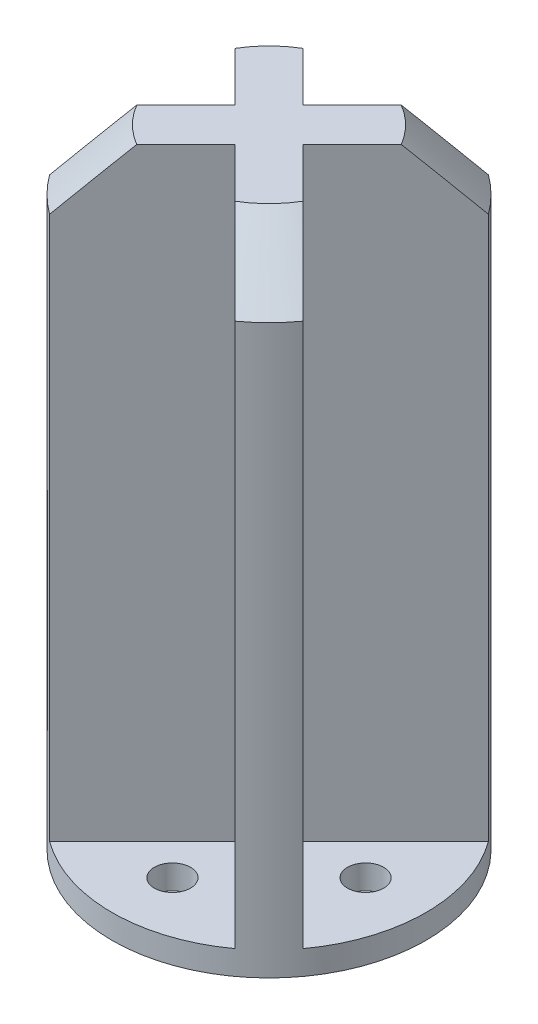
ISO-10303-21;
HEADER;
FILE_DESCRIPTION(('STEP AP214'),'2;1');
FILE_NAME('part.step','',(''),(''),'','','');
FILE_SCHEMA(('AUTOMOTIVE_DESIGN { 1 0 10303 214 1 1 1 1 }'));
ENDSEC;
DATA;
#1=APPLICATION_CONTEXT('core data for automotive mechanical design processes');
#2=APPLICATION_PROTOCOL_DEFINITION('international standard','automotive_design',2000,#1);
#3=PRODUCT_CONTEXT('',#1,'mechanical');
#4=PRODUCT('Part','Part','',(#3));
#5=PRODUCT_RELATED_PRODUCT_CATEGORY('part','',(#4));
#6=PRODUCT_DEFINITION_FORMATION('','',#4);
#7=PRODUCT_DEFINITION_CONTEXT('part definition',#1,'design');
#8=PRODUCT_DEFINITION('design','',#6,#7);
#9=PRODUCT_DEFINITION_SHAPE('','',#8);
#10=(LENGTH_UNIT() NAMED_UNIT(*) SI_UNIT(.MILLI.,.METRE.));
#11=(NAMED_UNIT(*) PLANE_ANGLE_UNIT() SI_UNIT($,.RADIAN.));
#12=(NAMED_UNIT(*) SI_UNIT($,.STERADIAN.) SOLID_ANGLE_UNIT());
#13=UNCERTAINTY_MEASURE_WITH_UNIT(LENGTH_MEASURE(1.E-05),#10,'distance_accuracy_value','');
#14=(GEOMETRIC_REPRESENTATION_CONTEXT(3) GLOBAL_UNCERTAINTY_ASSIGNED_CONTEXT((#13)) GLOBAL_UNIT_ASSIGNED_CONTEXT((#10,
#11,#12)) REPRESENTATION_CONTEXT('',''));
#15=CARTESIAN_POINT('',(0.,0.,0.));
#16=DIRECTION('',(0.,0.,1.));
#17=DIRECTION('',(1.,0.,0.));
#18=AXIS2_PLACEMENT_3D('',#15,#16,#17);
#19=CARTESIAN_POINT('',(0.,2.,0.));
#20=DIRECTION('',(0.,1.,0.));
#21=DIRECTION('',(0.,0.,1.));
#22=AXIS2_PLACEMENT_3D('',#19,#20,#21);
#23=PLANE('',#22);
#24=CARTESIAN_POINT('',(-8.,2.,0.));
#25=DIRECTION('',(0.,1.,0.));
#26=DIRECTION('',(0.,0.,1.));
#27=AXIS2_PLACEMENT_3D('',#24,#25,#26);
#28=CIRCLE('',#27,1.5);
#29=CARTESIAN_POINT('',(-8.,2.,1.5));
#30=VERTEX_POINT('',#29);
#31=EDGE_CURVE('E195',#30,#30,#28,.T.);
#32=ORIENTED_EDGE('',*,*,#31,.F.);
#33=EDGE_LOOP('',(#32));
#34=FACE_BOUND('',#33,.T.);
#35=CARTESIAN_POINT('',(0.,2.,0.));
#36=DIRECTION('',(0.,1.,0.));
#37=DIRECTION('',(0.,0.,1.));
#38=AXIS2_PLACEMENT_3D('',#35,#36,#37);
#39=CIRCLE('',#38,13.);
#40=CARTESIAN_POINT('',(-10.4971646246656,2.,-7.66873749991938));
#41=VERTEX_POINT('',#40);
#42=CARTESIAN_POINT('',(-10.4971646246656,2.,7.66873749991938));
#43=VERTEX_POINT('',#42);
#44=EDGE_CURVE('E218',#41,#43,#39,.T.);
#45=ORIENTED_EDGE('',*,*,#44,.T.);
#46=DIRECTION('',(0.707106781186548,0.,-0.707106781186548));
#47=VECTOR('',#46,1.);
#48=CARTESIAN_POINT('',(-1.4142135623731,2.,-1.4142135623731));
#49=LINE('',#48,#47);
#50=CARTESIAN_POINT('',(-2.82842712474619,2.,0.));
#51=VERTEX_POINT('',#50);
#52=EDGE_CURVE('E346',#43,#51,#49,.T.);
#53=ORIENTED_EDGE('',*,*,#52,.T.);
#54=DIRECTION('',(0.707106781186548,0.,0.707106781186547));
#55=VECTOR('',#54,1.);
#56=CARTESIAN_POINT('',(-1.41421356237309,2.,1.4142135623731));
#57=LINE('',#56,#55);
#58=EDGE_CURVE('E356',#41,#51,#57,.T.);
#59=ORIENTED_EDGE('',*,*,#58,.F.);
#60=EDGE_LOOP('',(#45,#53,#59));
#61=FACE_BOUND('',#60,.T.);
#62=ADVANCED_FACE('F35',(#34,#61),#23,.T.);
#63=CARTESIAN_POINT('',(0.,2.,-8.));
#64=DIRECTION('',(0.,1.,0.));
#65=DIRECTION('',(0.,0.,1.));
#66=AXIS2_PLACEMENT_3D('',#63,#64,#65);
#67=CIRCLE('',#66,1.5);
#68=CARTESIAN_POINT('',(0.,2.,-6.5));
#69=VERTEX_POINT('',#68);
#70=EDGE_CURVE('E201',#69,#69,#67,.T.);
#71=ORIENTED_EDGE('',*,*,#70,.F.);
#72=EDGE_LOOP('',(#71));
#73=FACE_BOUND('',#72,.T.);
#74=CARTESIAN_POINT('',(7.66873749991938,2.,-10.4971646246656));
#75=VERTEX_POINT('',#74);
#76=CARTESIAN_POINT('',(-7.66873749991939,2.,-10.4971646246656));
#77=VERTEX_POINT('',#76);
#78=EDGE_CURVE('E386',#75,#77,#39,.T.);
#79=ORIENTED_EDGE('',*,*,#78,.T.);
#80=DIRECTION('',(0.707106781186548,0.,0.707106781186547));
#81=VECTOR('',#80,1.);
#82=CARTESIAN_POINT('',(1.4142135623731,2.,-1.4142135623731));
#83=LINE('',#82,#81);
#84=CARTESIAN_POINT('',(0.,2.,-2.82842712474619));
#85=VERTEX_POINT('',#84);
#86=EDGE_CURVE('E354',#77,#85,#83,.T.);
#87=ORIENTED_EDGE('',*,*,#86,.T.);
#88=DIRECTION('',(-0.707106781186548,0.,0.707106781186548));
#89=VECTOR('',#88,1.);
#90=CARTESIAN_POINT('',(-1.41421356237309,2.,-1.41421356237309));
#91=LINE('',#90,#89);
#92=EDGE_CURVE('E351',#75,#85,#91,.T.);
#93=ORIENTED_EDGE('',*,*,#92,.F.);
#94=EDGE_LOOP('',(#79,#87,#93));
#95=FACE_BOUND('',#94,.T.);
#96=ADVANCED_FACE('F314',(#73,#95),#23,.T.);
#97=CARTESIAN_POINT('',(8.,2.,0.));
#98=DIRECTION('',(0.,1.,0.));
#99=DIRECTION('',(0.,0.,1.));
#100=AXIS2_PLACEMENT_3D('',#97,#98,#99);
#101=CIRCLE('',#100,1.5);
#102=CARTESIAN_POINT('',(8.,2.,1.50000000000006));
#103=VERTEX_POINT('',#102);
#104=EDGE_CURVE('E207',#103,#103,#101,.T.);
#105=ORIENTED_EDGE('',*,*,#104,.F.);
#106=EDGE_LOOP('',(#105));
#107=FACE_BOUND('',#106,.T.);
#108=CARTESIAN_POINT('',(10.4971646246656,2.,7.66873749991938));
#109=VERTEX_POINT('',#108);
#110=CARTESIAN_POINT('',(10.4971646246656,2.,-7.66873749991938));
#111=VERTEX_POINT('',#110);
#112=EDGE_CURVE('E219',#109,#111,#39,.T.);
#113=ORIENTED_EDGE('',*,*,#112,.T.);
#114=DIRECTION('',(-0.707106781186548,0.,0.707106781186548));
#115=VECTOR('',#114,1.);
#116=CARTESIAN_POINT('',(1.41421356237309,2.,1.41421356237309));
#117=LINE('',#116,#115);
#118=CARTESIAN_POINT('',(2.82842712474619,2.,0.));
#119=VERTEX_POINT('',#118);
#120=EDGE_CURVE('E344',#111,#119,#117,.T.);
#121=ORIENTED_EDGE('',*,*,#120,.T.);
#122=DIRECTION('',(-0.707106781186548,0.,-0.707106781186547));
#123=VECTOR('',#122,1.);
#124=CARTESIAN_POINT('',(1.41421356237309,2.,-1.41421356237309));
#125=LINE('',#124,#123);
#126=EDGE_CURVE('E341',#109,#119,#125,.T.);
#127=ORIENTED_EDGE('',*,*,#126,.F.);
#128=EDGE_LOOP('',(#113,#121,#127));
#129=FACE_BOUND('',#128,.T.);
#130=ADVANCED_FACE('F321',(#107,#129),#23,.T.);
#131=CARTESIAN_POINT('',(0.,2.,8.));
#132=DIRECTION('',(0.,1.,0.));
#133=DIRECTION('',(0.,0.,1.));
#134=AXIS2_PLACEMENT_3D('',#131,#132,#133);
#135=CIRCLE('',#134,1.5);
#136=CARTESIAN_POINT('',(0.,2.,9.5));
#137=VERTEX_POINT('',#136);
#138=EDGE_CURVE('E190',#137,#137,#135,.T.);
#139=ORIENTED_EDGE('',*,*,#138,.F.);
#140=EDGE_LOOP('',(#139));
#141=FACE_BOUND('',#140,.T.);
#142=CARTESIAN_POINT('',(-7.66873749991938,2.,10.4971646246656));
#143=VERTEX_POINT('',#142);
#144=CARTESIAN_POINT('',(7.66873749991938,2.,10.4971646246656));
#145=VERTEX_POINT('',#144);
#146=EDGE_CURVE('E215',#143,#145,#39,.T.);
#147=ORIENTED_EDGE('',*,*,#146,.T.);
#148=DIRECTION('',(-0.707106781186547,0.,-0.707106781186548));
#149=VECTOR('',#148,1.);
#150=CARTESIAN_POINT('',(-1.41421356237309,2.,1.41421356237309));
#151=LINE('',#150,#149);
#152=CARTESIAN_POINT('',(0.,2.,2.82842712474619));
#153=VERTEX_POINT('',#152);
#154=EDGE_CURVE('E339',#145,#153,#151,.T.);
#155=ORIENTED_EDGE('',*,*,#154,.T.);
#156=DIRECTION('',(0.707106781186548,0.,-0.707106781186548));
#157=VECTOR('',#156,1.);
#158=CARTESIAN_POINT('',(1.41421356237309,2.,1.41421356237309));
#159=LINE('',#158,#157);
#160=EDGE_CURVE('E179',#143,#153,#159,.T.);
#161=ORIENTED_EDGE('',*,*,#160,.F.);
#162=EDGE_LOOP('',(#147,#155,#161));
#163=FACE_BOUND('',#162,.T.);
#164=ADVANCED_FACE('F317',(#141,#163),#23,.T.);
#165=CARTESIAN_POINT('',(0.,2.,0.));
#166=DIRECTION('',(0.,-1.,0.));
#167=DIRECTION('',(0.,0.,-1.));
#168=AXIS2_PLACEMENT_3D('',#165,#166,#167);
#169=CYLINDRICAL_SURFACE('',#168,13.);
#170=DIRECTION('',(0.,-1.,0.));
#171=VECTOR('',#170,1.);
#172=CARTESIAN_POINT('',(-7.66873749991938,52.,10.4971646246656));
#173=LINE('',#172,#171);
#174=CARTESIAN_POINT('',(-7.66873749991938,47.,10.4971646246656));
#175=VERTEX_POINT('',#174);
#176=EDGE_CURVE('E180',#175,#143,#173,.T.);
#177=ORIENTED_EDGE('',*,*,#176,.F.);
#178=CARTESIAN_POINT('',(0.,47.,0.));
#179=DIRECTION('',(0.,1.,0.));
#180=DIRECTION('',(0.,0.,1.));
#181=AXIS2_PLACEMENT_3D('',#178,#179,#180);
#182=CIRCLE('',#181,13.);
#183=CARTESIAN_POINT('',(-10.4971646246656,47.,7.66873749991938));
#184=VERTEX_POINT('',#183);
#185=EDGE_CURVE('E265',#175,#184,#182,.F.);
#186=ORIENTED_EDGE('',*,*,#185,.T.);
#187=DIRECTION('',(0.,-1.,0.));
#188=VECTOR('',#187,1.);
#189=CARTESIAN_POINT('',(-10.4971646246656,52.,7.66873749991938));
#190=LINE('',#189,#188);
#191=EDGE_CURVE('E183',#184,#43,#190,.T.);
#192=ORIENTED_EDGE('',*,*,#191,.T.);
#193=ORIENTED_EDGE('',*,*,#44,.F.);
#194=DIRECTION('',(0.,-1.,0.));
#195=VECTOR('',#194,1.);
#196=CARTESIAN_POINT('',(-10.4971646246656,52.,-7.66873749991938));
#197=LINE('',#196,#195);
#198=CARTESIAN_POINT('',(-10.4971646246656,47.,-7.66873749991938));
#199=VERTEX_POINT('',#198);
#200=EDGE_CURVE('E362',#199,#41,#197,.T.);
#201=ORIENTED_EDGE('',*,*,#200,.F.);
#202=CARTESIAN_POINT('',(0.,47.,0.));
#203=DIRECTION('',(0.,1.,0.));
#204=DIRECTION('',(0.,0.,1.));
#205=AXIS2_PLACEMENT_3D('',#202,#203,#204);
#206=CIRCLE('',#205,13.);
#207=CARTESIAN_POINT('',(-7.66873749991939,47.,-10.4971646246656));
#208=VERTEX_POINT('',#207);
#209=EDGE_CURVE('E238',#199,#208,#206,.F.);
#210=ORIENTED_EDGE('',*,*,#209,.T.);
#211=DIRECTION('',(0.,-1.,0.));
#212=VECTOR('',#211,1.);
#213=CARTESIAN_POINT('',(-7.66873749991939,52.,-10.4971646246656));
#214=LINE('',#213,#212);
#215=EDGE_CURVE('E365',#208,#77,#214,.T.);
#216=ORIENTED_EDGE('',*,*,#215,.T.);
#217=ORIENTED_EDGE('',*,*,#78,.F.);
#218=DIRECTION('',(0.,-1.,0.));
#219=VECTOR('',#218,1.);
#220=CARTESIAN_POINT('',(7.66873749991938,52.,-10.4971646246656));
#221=LINE('',#220,#219);
#222=CARTESIAN_POINT('',(7.66873749991938,47.,-10.4971646246656));
#223=VERTEX_POINT('',#222);
#224=EDGE_CURVE('E370',#223,#75,#221,.T.);
#225=ORIENTED_EDGE('',*,*,#224,.F.);
#226=CARTESIAN_POINT('',(0.,47.,0.));
#227=DIRECTION('',(0.,1.,0.));
#228=DIRECTION('',(0.,0.,1.));
#229=AXIS2_PLACEMENT_3D('',#226,#227,#228);
#230=CIRCLE('',#229,13.);
#231=CARTESIAN_POINT('',(10.4971646246656,47.,-7.66873749991938));
#232=VERTEX_POINT('',#231);
#233=EDGE_CURVE('E55',#223,#232,#230,.F.);
#234=ORIENTED_EDGE('',*,*,#233,.T.);
#235=DIRECTION('',(0.,-1.,0.));
#236=VECTOR('',#235,1.);
#237=CARTESIAN_POINT('',(10.4971646246656,52.,-7.66873749991938));
#238=LINE('',#237,#236);
#239=EDGE_CURVE('E372',#232,#111,#238,.T.);
#240=ORIENTED_EDGE('',*,*,#239,.T.);
#241=ORIENTED_EDGE('',*,*,#112,.F.);
#242=DIRECTION('',(0.,-1.,0.));
#243=VECTOR('',#242,1.);
#244=CARTESIAN_POINT('',(10.4971646246656,52.,7.66873749991938));
#245=LINE('',#244,#243);
#246=CARTESIAN_POINT('',(10.4971646246656,47.,7.66873749991938));
#247=VERTEX_POINT('',#246);
#248=EDGE_CURVE('E185',#247,#109,#245,.T.);
#249=ORIENTED_EDGE('',*,*,#248,.F.);
#250=CARTESIAN_POINT('',(0.,47.,0.));
#251=DIRECTION('',(0.,1.,0.));
#252=DIRECTION('',(0.,0.,1.));
#253=AXIS2_PLACEMENT_3D('',#250,#251,#252);
#254=CIRCLE('',#253,13.);
#255=CARTESIAN_POINT('',(7.66873749991938,47.,10.4971646246656));
#256=VERTEX_POINT('',#255);
#257=EDGE_CURVE('E419',#247,#256,#254,.F.);
#258=ORIENTED_EDGE('',*,*,#257,.T.);
#259=DIRECTION('',(0.,-1.,0.));
#260=VECTOR('',#259,1.);
#261=CARTESIAN_POINT('',(7.66873749991938,52.,10.4971646246656));
#262=LINE('',#261,#260);
#263=EDGE_CURVE('E181',#256,#145,#262,.T.);
#264=ORIENTED_EDGE('',*,*,#263,.T.);
#265=ORIENTED_EDGE('',*,*,#146,.F.);
#266=EDGE_LOOP('',(#177,#186,#192,#193,#201,#210,#216,#217,#225,#234,#240,#241,#249,#258,#264,#265));
#267=FACE_BOUND('',#266,.T.);
#268=CARTESIAN_POINT('',(0.,0.,0.));
#269=DIRECTION('',(0.,1.,0.));
#270=DIRECTION('',(0.,0.,1.));
#271=AXIS2_PLACEMENT_3D('',#268,#269,#270);
#272=CIRCLE('',#271,13.);
#273=CARTESIAN_POINT('',(0.,0.,13.));
#274=VERTEX_POINT('',#273);
#275=EDGE_CURVE('E194',#274,#274,#272,.T.);
#276=ORIENTED_EDGE('',*,*,#275,.T.);
#277=EDGE_LOOP('',(#276));
#278=FACE_BOUND('',#277,.T.);
#279=ADVANCED_FACE('F328',(#267,#278),#169,.T.);
#280=CARTESIAN_POINT('',(0.,0.,0.));
#281=DIRECTION('',(0.,1.,0.));
#282=DIRECTION('',(0.,0.,1.));
#283=AXIS2_PLACEMENT_3D('',#280,#281,#282);
#284=PLANE('',#283);
#285=CARTESIAN_POINT('',(-8.,0.,0.));
#286=DIRECTION('',(0.,1.,0.));
#287=DIRECTION('',(0.,0.,1.));
#288=AXIS2_PLACEMENT_3D('',#285,#286,#287);
#289=CIRCLE('',#288,1.5);
#290=CARTESIAN_POINT('',(-8.,0.,1.5));
#291=VERTEX_POINT('',#290);
#292=EDGE_CURVE('E191',#291,#291,#289,.T.);
#293=ORIENTED_EDGE('',*,*,#292,.T.);
#294=EDGE_LOOP('',(#293));
#295=FACE_BOUND('',#294,.T.);
#296=CARTESIAN_POINT('',(0.,0.,-8.));
#297=DIRECTION('',(0.,1.,0.));
#298=DIRECTION('',(0.,0.,1.));
#299=AXIS2_PLACEMENT_3D('',#296,#297,#298);
#300=CIRCLE('',#299,1.5);
#301=CARTESIAN_POINT('',(0.,0.,-6.5));
#302=VERTEX_POINT('',#301);
#303=EDGE_CURVE('E198',#302,#302,#300,.T.);
#304=ORIENTED_EDGE('',*,*,#303,.T.);
#305=EDGE_LOOP('',(#304));
#306=FACE_BOUND('',#305,.T.);
#307=CARTESIAN_POINT('',(8.,0.,0.));
#308=DIRECTION('',(0.,1.,0.));
#309=DIRECTION('',(0.,0.,1.));
#310=AXIS2_PLACEMENT_3D('',#307,#308,#309);
#311=CIRCLE('',#310,1.5);
#312=CARTESIAN_POINT('',(8.,0.,1.50000000000006));
#313=VERTEX_POINT('',#312);
#314=EDGE_CURVE('E204',#313,#313,#311,.T.);
#315=ORIENTED_EDGE('',*,*,#314,.T.);
#316=EDGE_LOOP('',(#315));
#317=FACE_BOUND('',#316,.T.);
#318=CARTESIAN_POINT('',(0.,0.,8.));
#319=DIRECTION('',(0.,1.,0.));
#320=DIRECTION('',(0.,0.,1.));
#321=AXIS2_PLACEMENT_3D('',#318,#319,#320);
#322=CIRCLE('',#321,1.5);
#323=CARTESIAN_POINT('',(0.,0.,9.5));
#324=VERTEX_POINT('',#323);
#325=EDGE_CURVE('E210',#324,#324,#322,.T.);
#326=ORIENTED_EDGE('',*,*,#325,.T.);
#327=EDGE_LOOP('',(#326));
#328=FACE_BOUND('',#327,.T.);
#329=ORIENTED_EDGE('',*,*,#275,.F.);
#330=EDGE_LOOP('',(#329));
#331=FACE_BOUND('',#330,.T.);
#332=ADVANCED_FACE('F334',(#295,#306,#317,#328,#331),#284,.F.);
#333=CARTESIAN_POINT('',(0.,0.,8.));
#334=DIRECTION('',(0.,1.,0.));
#335=DIRECTION('',(0.,0.,1.));
#336=AXIS2_PLACEMENT_3D('',#333,#334,#335);
#337=CYLINDRICAL_SURFACE('',#336,1.5);
#338=ORIENTED_EDGE('',*,*,#325,.F.);
#339=EDGE_LOOP('',(#338));
#340=FACE_BOUND('',#339,.T.);
#341=ORIENTED_EDGE('',*,*,#138,.T.);
#342=EDGE_LOOP('',(#341));
#343=FACE_BOUND('',#342,.T.);
#344=ADVANCED_FACE('F486',(#340,#343),#337,.F.);
#345=CARTESIAN_POINT('',(8.,0.,0.));
#346=DIRECTION('',(0.,1.,0.));
#347=DIRECTION('',(0.,0.,1.));
#348=AXIS2_PLACEMENT_3D('',#345,#346,#347);
#349=CYLINDRICAL_SURFACE('',#348,1.5);
#350=ORIENTED_EDGE('',*,*,#314,.F.);
#351=EDGE_LOOP('',(#350));
#352=FACE_BOUND('',#351,.T.);
#353=ORIENTED_EDGE('',*,*,#104,.T.);
#354=EDGE_LOOP('',(#353));
#355=FACE_BOUND('',#354,.T.);
#356=ADVANCED_FACE('F479',(#352,#355),#349,.F.);
#357=CARTESIAN_POINT('',(0.,0.,-8.));
#358=DIRECTION('',(0.,1.,0.));
#359=DIRECTION('',(0.,0.,1.));
#360=AXIS2_PLACEMENT_3D('',#357,#358,#359);
#361=CYLINDRICAL_SURFACE('',#360,1.5);
#362=ORIENTED_EDGE('',*,*,#303,.F.);
#363=EDGE_LOOP('',(#362));
#364=FACE_BOUND('',#363,.T.);
#365=ORIENTED_EDGE('',*,*,#70,.T.);
#366=EDGE_LOOP('',(#365));
#367=FACE_BOUND('',#366,.T.);
#368=ADVANCED_FACE('F472',(#364,#367),#361,.F.);
#369=CARTESIAN_POINT('',(-8.,0.,0.));
#370=DIRECTION('',(0.,1.,0.));
#371=DIRECTION('',(0.,0.,1.));
#372=AXIS2_PLACEMENT_3D('',#369,#370,#371);
#373=CYLINDRICAL_SURFACE('',#372,1.5);
#374=ORIENTED_EDGE('',*,*,#292,.F.);
#375=EDGE_LOOP('',(#374));
#376=FACE_BOUND('',#375,.T.);
#377=ORIENTED_EDGE('',*,*,#31,.T.);
#378=EDGE_LOOP('',(#377));
#379=FACE_BOUND('',#378,.T.);
#380=ADVANCED_FACE('F254',(#376,#379),#373,.F.);
#381=CARTESIAN_POINT('',(-1.4142135623731,52.,-1.4142135623731));
#382=DIRECTION('',(-0.707106781186548,0.,-0.707106781186548));
#383=DIRECTION('',(-0.707106781186548,0.,0.707106781186548));
#384=AXIS2_PLACEMENT_3D('',#381,#382,#383);
#385=PLANE('',#384);
#386=ORIENTED_EDGE('',*,*,#191,.F.);
#387=CARTESIAN_POINT('',(-10.4971646246656,47.,7.66873749991938));
#388=CARTESIAN_POINT('',(-10.1978085103942,47.4182810547316,7.36938138564799));
#389=CARTESIAN_POINT('',(-9.89830082391415,47.8363458223949,7.06987369916796));
#390=CARTESIAN_POINT('',(-9.29881123792897,48.671789774902,6.47038411318278));
#391=CARTESIAN_POINT('',(-8.99882934116681,49.0891689636832,6.17040221642062));
#392=CARTESIAN_POINT('',(-8.39821569795847,49.9229951338139,5.56978857321228));
#393=CARTESIAN_POINT('',(-8.09758394908969,50.3394421116763,5.2691568243435));
#394=CARTESIAN_POINT('',(-7.64591512986106,50.9630705695294,4.81748800511487));
#395=CARTESIAN_POINT('',(-7.49523822371494,51.1707736489752,4.66681109896875));
#396=CARTESIAN_POINT('',(-7.19358147844221,51.5857399233736,4.36515435369602));
#397=CARTESIAN_POINT('',(-7.04260163888395,51.7930031176986,4.21417451413776));
#398=CARTESIAN_POINT('',(-6.89143913742476,52.,4.06301201267856));
#399=B_SPLINE_CURVE_WITH_KNOTS('',3,(#387,#388,#389,#390,#391,#392,#393,#394,#395,#396,#397,
#398),.UNSPECIFIED.,.F.,.F.,(4,2,2,2,2,4),(0.,1.78540947040084,3.57080865090652,
5.35621449879311,6.24892255010307,7.14163187433938),.UNSPECIFIED.);
#400=CARTESIAN_POINT('',(-6.89143913742476,52.,4.06301201267857));
#401=VERTEX_POINT('',#400);
#402=EDGE_CURVE('E258',#184,#401,#399,.T.);
#403=ORIENTED_EDGE('',*,*,#402,.T.);
#404=DIRECTION('',(0.707106781186548,0.,-0.707106781186548));
#405=VECTOR('',#404,1.);
#406=CARTESIAN_POINT('',(-1.4142135623731,52.,-1.4142135623731));
#407=LINE('',#406,#405);
#408=CARTESIAN_POINT('',(-2.82842712474619,52.,0.));
#409=VERTEX_POINT('',#408);
#410=EDGE_CURVE('E175',#401,#409,#407,.T.);
#411=ORIENTED_EDGE('',*,*,#410,.T.);
#412=DIRECTION('',(0.,-1.,0.));
#413=VECTOR('',#412,1.);
#414=CARTESIAN_POINT('',(-2.82842712474619,52.,0.));
#415=LINE('',#414,#413);
#416=EDGE_CURVE('E359',#409,#51,#415,.T.);
#417=ORIENTED_EDGE('',*,*,#416,.T.);
#418=ORIENTED_EDGE('',*,*,#52,.F.);
#419=EDGE_LOOP('',(#386,#403,#411,#417,#418));
#420=FACE_BOUND('',#419,.T.);
#421=ADVANCED_FACE('F248',(#420),#385,.T.);
#422=CARTESIAN_POINT('',(1.41421356237309,52.,1.41421356237309));
#423=DIRECTION('',(-0.707106781186548,0.,-0.707106781186548));
#424=DIRECTION('',(-0.707106781186548,0.,0.707106781186548));
#425=AXIS2_PLACEMENT_3D('',#422,#423,#424);
#426=PLANE('',#425);
#427=DIRECTION('',(0.707106781186548,0.,-0.707106781186548));
#428=VECTOR('',#427,1.);
#429=CARTESIAN_POINT('',(1.41421356237309,52.,1.41421356237309));
#430=LINE('',#429,#428);
#431=CARTESIAN_POINT('',(-4.06301201267857,52.,6.89143913742475));
#432=VERTEX_POINT('',#431);
#433=CARTESIAN_POINT('',(0.,52.,2.82842712474619));
#434=VERTEX_POINT('',#433);
#435=EDGE_CURVE('E166',#432,#434,#430,.T.);
#436=ORIENTED_EDGE('',*,*,#435,.F.);
#437=CARTESIAN_POINT('',(-4.06301201267857,52.,6.89143913742475));
#438=CARTESIAN_POINT('',(-4.21417451413776,51.7930031176986,7.04260163888395));
#439=CARTESIAN_POINT('',(-4.36515435369602,51.5857399233736,7.1935814784422));
#440=CARTESIAN_POINT('',(-4.66681109896875,51.1707736489752,7.49523822371493));
#441=CARTESIAN_POINT('',(-4.81748800511487,50.9630705695294,7.64591512986106));
#442=CARTESIAN_POINT('',(-5.2691568243435,50.3394421116763,8.09758394908969));
#443=CARTESIAN_POINT('',(-5.56978857321229,49.9229951338139,8.39821569795847));
#444=CARTESIAN_POINT('',(-6.17040221642062,49.0891689636832,8.99882934116681));
#445=CARTESIAN_POINT('',(-6.47038411318278,48.671789774902,9.29881123792897));
#446=CARTESIAN_POINT('',(-7.06987369916796,47.8363458223949,9.89830082391415));
#447=CARTESIAN_POINT('',(-7.369381385648,47.4182810547316,10.1978085103942));
#448=CARTESIAN_POINT('',(-7.66873749991938,47.,10.4971646246656));
#449=B_SPLINE_CURVE_WITH_KNOTS('',3,(#437,#438,#439,#440,#441,#442,#443,#444,#445,#446,#447,
#448),.UNSPECIFIED.,.F.,.F.,(4,2,2,2,2,4),(0.,0.892709324236305,1.78541737554626,
3.57082322343286,5.35622240393855,7.14163187433938),.UNSPECIFIED.);
#450=EDGE_CURVE('E231',#432,#175,#449,.T.);
#451=ORIENTED_EDGE('',*,*,#450,.T.);
#452=ORIENTED_EDGE('',*,*,#176,.T.);
#453=ORIENTED_EDGE('',*,*,#160,.T.);
#454=DIRECTION('',(0.,-1.,0.));
#455=VECTOR('',#454,1.);
#456=CARTESIAN_POINT('',(0.,52.,2.82842712474619));
#457=LINE('',#456,#455);
#458=EDGE_CURVE('E158',#434,#153,#457,.T.);
#459=ORIENTED_EDGE('',*,*,#458,.F.);
#460=EDGE_LOOP('',(#436,#451,#452,#453,#459));
#461=FACE_BOUND('',#460,.T.);
#462=ADVANCED_FACE('F177',(#461),#426,.F.);
#463=CARTESIAN_POINT('',(-1.41421356237309,52.,1.41421356237309));
#464=DIRECTION('',(-0.707106781186548,0.,0.707106781186547));
#465=DIRECTION('',(0.707106781186547,0.,0.707106781186548));
#466=AXIS2_PLACEMENT_3D('',#463,#464,#465);
#467=PLANE('',#466);
#468=ORIENTED_EDGE('',*,*,#263,.F.);
#469=CARTESIAN_POINT('',(7.66873749991938,47.,10.4971646246656));
#470=CARTESIAN_POINT('',(7.36938138564799,47.4182810547316,10.1978085103942));
#471=CARTESIAN_POINT('',(7.06987369916795,47.8363458223949,9.89830082391415));
#472=CARTESIAN_POINT('',(6.47038411318277,48.671789774902,9.29881123792897));
#473=CARTESIAN_POINT('',(6.17040221642061,49.0891689636832,8.99882934116681));
#474=CARTESIAN_POINT('',(5.56978857321228,49.9229951338139,8.39821569795847));
#475=CARTESIAN_POINT('',(5.26915682434349,50.3394421116763,8.09758394908969));
#476=CARTESIAN_POINT('',(4.81748800511487,50.9630705695294,7.64591512986106));
#477=CARTESIAN_POINT('',(4.66681109896874,51.1707736489752,7.49523822371494));
#478=CARTESIAN_POINT('',(4.36515435369601,51.5857399233736,7.19358147844221));
#479=CARTESIAN_POINT('',(4.21417451413776,51.7930031176986,7.04260163888395));
#480=CARTESIAN_POINT('',(4.06301201267856,52.,6.89143913742475));
#481=B_SPLINE_CURVE_WITH_KNOTS('',3,(#469,#470,#471,#472,#473,#474,#475,#476,#477,#478,#479,
#480),.UNSPECIFIED.,.F.,.F.,(4,2,2,2,2,4),(0.,1.78540947040084,3.57080865090652,
5.35621449879311,6.24892255010307,7.14163187433938),.UNSPECIFIED.);
#482=CARTESIAN_POINT('',(4.06301201267856,52.,6.89143913742475));
#483=VERTEX_POINT('',#482);
#484=EDGE_CURVE('E161',#256,#483,#481,.T.);
#485=ORIENTED_EDGE('',*,*,#484,.T.);
#486=DIRECTION('',(-0.707106781186547,0.,-0.707106781186548));
#487=VECTOR('',#486,1.);
#488=CARTESIAN_POINT('',(-1.41421356237309,52.,1.41421356237309));
#489=LINE('',#488,#487);
#490=EDGE_CURVE('E152',#483,#434,#489,.T.);
#491=ORIENTED_EDGE('',*,*,#490,.T.);
#492=ORIENTED_EDGE('',*,*,#458,.T.);
#493=ORIENTED_EDGE('',*,*,#154,.F.);
#494=EDGE_LOOP('',(#468,#485,#491,#492,#493));
#495=FACE_BOUND('',#494,.T.);
#496=ADVANCED_FACE('F155',(#495),#467,.T.);
#497=CARTESIAN_POINT('',(1.41421356237309,52.,-1.41421356237309));
#498=DIRECTION('',(-0.707106781186547,0.,0.707106781186548));
#499=DIRECTION('',(0.707106781186548,0.,0.707106781186547));
#500=AXIS2_PLACEMENT_3D('',#497,#498,#499);
#501=PLANE('',#500);
#502=DIRECTION('',(-0.707106781186548,0.,-0.707106781186547));
#503=VECTOR('',#502,1.);
#504=CARTESIAN_POINT('',(1.41421356237309,52.,-1.41421356237309));
#505=LINE('',#504,#503);
#506=CARTESIAN_POINT('',(6.89143913742475,52.,4.06301201267856));
#507=VERTEX_POINT('',#506);
#508=CARTESIAN_POINT('',(2.82842712474619,52.,0.));
#509=VERTEX_POINT('',#508);
#510=EDGE_CURVE('E165',#507,#509,#505,.T.);
#511=ORIENTED_EDGE('',*,*,#510,.F.);
#512=CARTESIAN_POINT('',(6.89143913742475,52.,4.06301201267856));
#513=CARTESIAN_POINT('',(7.04260163888395,51.7930031176986,4.21417451413775));
#514=CARTESIAN_POINT('',(7.1935814784422,51.5857399233736,4.36515435369601));
#515=CARTESIAN_POINT('',(7.49523822371494,51.1707736489752,4.66681109896874));
#516=CARTESIAN_POINT('',(7.64591512986106,50.9630705695294,4.81748800511486));
#517=CARTESIAN_POINT('',(8.09758394908969,50.3394421116763,5.26915682434349));
#518=CARTESIAN_POINT('',(8.39821569795847,49.9229951338139,5.56978857321228));
#519=CARTESIAN_POINT('',(8.99882934116681,49.0891689636832,6.17040221642061));
#520=CARTESIAN_POINT('',(9.29881123792897,48.671789774902,6.47038411318277));
#521=CARTESIAN_POINT('',(9.89830082391415,47.8363458223949,7.06987369916795));
#522=CARTESIAN_POINT('',(10.1978085103942,47.4182810547316,7.36938138564799));
#523=CARTESIAN_POINT('',(10.4971646246656,47.,7.66873749991938));
#524=B_SPLINE_CURVE_WITH_KNOTS('',3,(#512,#513,#514,#515,#516,#517,#518,#519,#520,#521,#522,
#523),.UNSPECIFIED.,.F.,.F.,(4,2,2,2,2,4),(0.,0.892709324236305,1.78541737554626,
3.57082322343285,5.35622240393854,7.14163187433938),.UNSPECIFIED.);
#525=EDGE_CURVE('E264',#507,#247,#524,.T.);
#526=ORIENTED_EDGE('',*,*,#525,.T.);
#527=ORIENTED_EDGE('',*,*,#248,.T.);
#528=ORIENTED_EDGE('',*,*,#126,.T.);
#529=DIRECTION('',(0.,-1.,0.));
#530=VECTOR('',#529,1.);
#531=CARTESIAN_POINT('',(2.82842712474619,52.,0.));
#532=LINE('',#531,#530);
#533=EDGE_CURVE('E374',#509,#119,#532,.T.);
#534=ORIENTED_EDGE('',*,*,#533,.F.);
#535=EDGE_LOOP('',(#511,#526,#527,#528,#534));
#536=FACE_BOUND('',#535,.T.);
#537=ADVANCED_FACE('F277',(#536),#501,.F.);
#538=CARTESIAN_POINT('',(1.41421356237309,52.,1.41421356237309));
#539=DIRECTION('',(0.707106781186548,0.,0.707106781186548));
#540=DIRECTION('',(0.707106781186548,0.,-0.707106781186548));
#541=AXIS2_PLACEMENT_3D('',#538,#539,#540);
#542=PLANE('',#541);
#543=ORIENTED_EDGE('',*,*,#239,.F.);
#544=CARTESIAN_POINT('',(10.4971646246656,47.,-7.66873749991938));
#545=CARTESIAN_POINT('',(10.1978085103942,47.4182810547316,-7.369381385648));
#546=CARTESIAN_POINT('',(9.89830082391415,47.8363458223949,-7.06987369916796));
#547=CARTESIAN_POINT('',(9.29881123792896,48.671789774902,-6.47038411318278));
#548=CARTESIAN_POINT('',(8.99882934116681,49.0891689636832,-6.17040221642062));
#549=CARTESIAN_POINT('',(8.39821569795847,49.9229951338139,-5.56978857321228));
#550=CARTESIAN_POINT('',(8.09758394908968,50.3394421116763,-5.2691568243435));
#551=CARTESIAN_POINT('',(7.64591512986106,50.9630705695294,-4.81748800511487));
#552=CARTESIAN_POINT('',(7.49523822371493,51.1707736489752,-4.66681109896874));
#553=CARTESIAN_POINT('',(7.1935814784422,51.5857399233736,-4.36515435369601));
#554=CARTESIAN_POINT('',(7.04260163888394,51.7930031176986,-4.21417451413776));
#555=CARTESIAN_POINT('',(6.89143913742475,52.,-4.06301201267856));
#556=B_SPLINE_CURVE_WITH_KNOTS('',3,(#544,#545,#546,#547,#548,#549,#550,#551,#552,#553,#554,
#555),.UNSPECIFIED.,.F.,.F.,(4,2,2,2,2,4),(0.,1.78540947040084,3.57080865090652,
5.35621449879312,6.24892255010307,7.14163187433938),.UNSPECIFIED.);
#557=CARTESIAN_POINT('',(6.89143913742475,52.,-4.06301201267856));
#558=VERTEX_POINT('',#557);
#559=EDGE_CURVE('E290',#232,#558,#556,.T.);
#560=ORIENTED_EDGE('',*,*,#559,.T.);
#561=DIRECTION('',(-0.707106781186548,0.,0.707106781186548));
#562=VECTOR('',#561,1.);
#563=CARTESIAN_POINT('',(1.41421356237309,52.,1.41421356237309));
#564=LINE('',#563,#562);
#565=EDGE_CURVE('E408',#558,#509,#564,.T.);
#566=ORIENTED_EDGE('',*,*,#565,.T.);
#567=ORIENTED_EDGE('',*,*,#533,.T.);
#568=ORIENTED_EDGE('',*,*,#120,.F.);
#569=EDGE_LOOP('',(#543,#560,#566,#567,#568));
#570=FACE_BOUND('',#569,.T.);
#571=ADVANCED_FACE('F281',(#570),#542,.T.);
#572=CARTESIAN_POINT('',(-1.41421356237309,52.,-1.41421356237309));
#573=DIRECTION('',(0.707106781186548,0.,0.707106781186548));
#574=DIRECTION('',(0.707106781186548,0.,-0.707106781186548));
#575=AXIS2_PLACEMENT_3D('',#572,#573,#574);
#576=PLANE('',#575);
#577=DIRECTION('',(-0.707106781186548,0.,0.707106781186548));
#578=VECTOR('',#577,1.);
#579=CARTESIAN_POINT('',(-1.41421356237309,52.,-1.41421356237309));
#580=LINE('',#579,#578);
#581=CARTESIAN_POINT('',(4.06301201267856,52.,-6.89143913742475));
#582=VERTEX_POINT('',#581);
#583=CARTESIAN_POINT('',(0.,52.,-2.82842712474619));
#584=VERTEX_POINT('',#583);
#585=EDGE_CURVE('E405',#582,#584,#580,.T.);
#586=ORIENTED_EDGE('',*,*,#585,.F.);
#587=CARTESIAN_POINT('',(4.06301201267856,52.,-6.89143913742475));
#588=CARTESIAN_POINT('',(4.21417451413776,51.7930031176986,-7.04260163888394));
#589=CARTESIAN_POINT('',(4.36515435369601,51.5857399233736,-7.1935814784422));
#590=CARTESIAN_POINT('',(4.66681109896874,51.1707736489752,-7.49523822371493));
#591=CARTESIAN_POINT('',(4.81748800511487,50.9630705695294,-7.64591512986106));
#592=CARTESIAN_POINT('',(5.2691568243435,50.3394421116763,-8.09758394908968));
#593=CARTESIAN_POINT('',(5.56978857321228,49.9229951338139,-8.39821569795847));
#594=CARTESIAN_POINT('',(6.17040221642062,49.0891689636832,-8.99882934116681));
#595=CARTESIAN_POINT('',(6.47038411318277,48.671789774902,-9.29881123792897));
#596=CARTESIAN_POINT('',(7.06987369916796,47.8363458223949,-9.89830082391415));
#597=CARTESIAN_POINT('',(7.36938138564799,47.4182810547316,-10.1978085103942));
#598=CARTESIAN_POINT('',(7.66873749991938,47.,-10.4971646246656));
#599=B_SPLINE_CURVE_WITH_KNOTS('',3,(#587,#588,#589,#590,#591,#592,#593,#594,#595,#596,#597,
#598),.UNSPECIFIED.,.F.,.F.,(4,2,2,2,2,4),(0.,0.892709324236306,1.78541737554626,
3.57082322343286,5.35622240393854,7.14163187433938),.UNSPECIFIED.);
#600=EDGE_CURVE('E63',#582,#223,#599,.T.);
#601=ORIENTED_EDGE('',*,*,#600,.T.);
#602=ORIENTED_EDGE('',*,*,#224,.T.);
#603=ORIENTED_EDGE('',*,*,#92,.T.);
#604=DIRECTION('',(0.,-1.,0.));
#605=VECTOR('',#604,1.);
#606=CARTESIAN_POINT('',(0.,52.,-2.82842712474619));
#607=LINE('',#606,#605);
#608=EDGE_CURVE('E367',#584,#85,#607,.T.);
#609=ORIENTED_EDGE('',*,*,#608,.F.);
#610=EDGE_LOOP('',(#586,#601,#602,#603,#609));
#611=FACE_BOUND('',#610,.T.);
#612=ADVANCED_FACE('F286',(#611),#576,.F.);
#613=CARTESIAN_POINT('',(1.4142135623731,52.,-1.4142135623731));
#614=DIRECTION('',(0.707106781186547,0.,-0.707106781186548));
#615=DIRECTION('',(-0.707106781186548,0.,-0.707106781186547));
#616=AXIS2_PLACEMENT_3D('',#613,#614,#615);
#617=PLANE('',#616);
#618=ORIENTED_EDGE('',*,*,#215,.F.);
#619=CARTESIAN_POINT('',(-7.66873749991938,47.,-10.4971646246656));
#620=CARTESIAN_POINT('',(-7.369381385648,47.4182810547316,-10.1978085103942));
#621=CARTESIAN_POINT('',(-7.06987369916796,47.8363458223949,-9.89830082391415));
#622=CARTESIAN_POINT('',(-6.47038411318278,48.671789774902,-9.29881123792896));
#623=CARTESIAN_POINT('',(-6.17040221642062,49.0891689636832,-8.9988293411668));
#624=CARTESIAN_POINT('',(-5.56978857321229,49.9229951338139,-8.39821569795847));
#625=CARTESIAN_POINT('',(-5.2691568243435,50.3394421116763,-8.09758394908969));
#626=CARTESIAN_POINT('',(-4.81748800511487,50.9630705695294,-7.64591512986106));
#627=CARTESIAN_POINT('',(-4.66681109896875,51.1707736489752,-7.49523822371493));
#628=CARTESIAN_POINT('',(-4.36515435369602,51.5857399233736,-7.1935814784422));
#629=CARTESIAN_POINT('',(-4.21417451413776,51.7930031176986,-7.04260163888395));
#630=CARTESIAN_POINT('',(-4.06301201267857,52.,-6.89143913742475));
#631=B_SPLINE_CURVE_WITH_KNOTS('',3,(#619,#620,#621,#622,#623,#624,#625,#626,#627,#628,#629,
#630),.UNSPECIFIED.,.F.,.F.,(4,2,2,2,2,4),(0.,1.78540947040084,3.57080865090652,
5.35621449879311,6.24892255010307,7.14163187433937),.UNSPECIFIED.);
#632=CARTESIAN_POINT('',(-4.06301201267857,52.,-6.89143913742475));
#633=VERTEX_POINT('',#632);
#634=EDGE_CURVE('E11',#208,#633,#631,.T.);
#635=ORIENTED_EDGE('',*,*,#634,.T.);
#636=DIRECTION('',(0.707106781186548,0.,0.707106781186547));
#637=VECTOR('',#636,1.);
#638=CARTESIAN_POINT('',(1.4142135623731,52.,-1.4142135623731));
#639=LINE('',#638,#637);
#640=EDGE_CURVE('E403',#633,#584,#639,.T.);
#641=ORIENTED_EDGE('',*,*,#640,.T.);
#642=ORIENTED_EDGE('',*,*,#608,.T.);
#643=ORIENTED_EDGE('',*,*,#86,.F.);
#644=EDGE_LOOP('',(#618,#635,#641,#642,#643));
#645=FACE_BOUND('',#644,.T.);
#646=ADVANCED_FACE('F430',(#645),#617,.T.);
#647=CARTESIAN_POINT('',(-1.41421356237309,52.,1.4142135623731));
#648=DIRECTION('',(0.707106781186547,0.,-0.707106781186548));
#649=DIRECTION('',(-0.707106781186548,0.,-0.707106781186547));
#650=AXIS2_PLACEMENT_3D('',#647,#648,#649);
#651=PLANE('',#650);
#652=DIRECTION('',(0.707106781186548,0.,0.707106781186547));
#653=VECTOR('',#652,1.);
#654=CARTESIAN_POINT('',(-1.41421356237309,52.,1.4142135623731));
#655=LINE('',#654,#653);
#656=CARTESIAN_POINT('',(-6.89143913742476,52.,-4.06301201267856));
#657=VERTEX_POINT('',#656);
#658=EDGE_CURVE('E363',#657,#409,#655,.T.);
#659=ORIENTED_EDGE('',*,*,#658,.F.);
#660=CARTESIAN_POINT('',(-6.89143913742476,52.,-4.06301201267856));
#661=CARTESIAN_POINT('',(-7.04260163888395,51.7930031176986,-4.21417451413776));
#662=CARTESIAN_POINT('',(-7.19358147844221,51.5857399233736,-4.36515435369601));
#663=CARTESIAN_POINT('',(-7.49523822371494,51.1707736489752,-4.66681109896874));
#664=CARTESIAN_POINT('',(-7.64591512986106,50.9630705695294,-4.81748800511487));
#665=CARTESIAN_POINT('',(-8.09758394908969,50.3394421116763,-5.26915682434349));
#666=CARTESIAN_POINT('',(-8.39821569795847,49.9229951338139,-5.56978857321228));
#667=CARTESIAN_POINT('',(-8.99882934116681,49.0891689636832,-6.17040221642061));
#668=CARTESIAN_POINT('',(-9.29881123792897,48.671789774902,-6.47038411318277));
#669=CARTESIAN_POINT('',(-9.89830082391415,47.8363458223949,-7.06987369916796));
#670=CARTESIAN_POINT('',(-10.1978085103942,47.4182810547316,-7.36938138564799));
#671=CARTESIAN_POINT('',(-10.4971646246656,47.,-7.66873749991938));
#672=B_SPLINE_CURVE_WITH_KNOTS('',3,(#660,#661,#662,#663,#664,#665,#666,#667,#668,#669,#670,
#671),.UNSPECIFIED.,.F.,.F.,(4,2,2,2,2,4),(0.,0.892709324236306,1.78541737554626,
3.57082322343285,5.35622240393854,7.14163187433937),.UNSPECIFIED.);
#673=EDGE_CURVE('E48',#657,#199,#672,.T.);
#674=ORIENTED_EDGE('',*,*,#673,.T.);
#675=ORIENTED_EDGE('',*,*,#200,.T.);
#676=ORIENTED_EDGE('',*,*,#58,.T.);
#677=ORIENTED_EDGE('',*,*,#416,.F.);
#678=EDGE_LOOP('',(#659,#674,#675,#676,#677));
#679=FACE_BOUND('',#678,.T.);
#680=ADVANCED_FACE('F414',(#679),#651,.F.);
#681=CARTESIAN_POINT('',(0.,52.,0.));
#682=DIRECTION('',(0.,1.,0.));
#683=DIRECTION('',(0.,0.,1.));
#684=AXIS2_PLACEMENT_3D('',#681,#682,#683);
#685=PLANE('',#684);
#686=ORIENTED_EDGE('',*,*,#410,.F.);
#687=CARTESIAN_POINT('',(0.,52.,0.));
#688=DIRECTION('',(0.,1.,0.));
#689=DIRECTION('',(0.,0.,1.));
#690=AXIS2_PLACEMENT_3D('',#687,#688,#689);
#691=CIRCLE('',#690,8.);
#692=EDGE_CURVE('E173',#401,#432,#691,.T.);
#693=ORIENTED_EDGE('',*,*,#692,.T.);
#694=ORIENTED_EDGE('',*,*,#435,.T.);
#695=ORIENTED_EDGE('',*,*,#490,.F.);
#696=CARTESIAN_POINT('',(0.,52.,0.));
#697=DIRECTION('',(0.,1.,0.));
#698=DIRECTION('',(0.,0.,1.));
#699=AXIS2_PLACEMENT_3D('',#696,#697,#698);
#700=CIRCLE('',#699,7.99999999999999);
#701=EDGE_CURVE('E228',#483,#507,#700,.T.);
#702=ORIENTED_EDGE('',*,*,#701,.T.);
#703=ORIENTED_EDGE('',*,*,#510,.T.);
#704=ORIENTED_EDGE('',*,*,#565,.F.);
#705=CARTESIAN_POINT('',(0.,52.,0.));
#706=DIRECTION('',(0.,1.,0.));
#707=DIRECTION('',(0.,0.,1.));
#708=AXIS2_PLACEMENT_3D('',#705,#706,#707);
#709=CIRCLE('',#708,7.99999999999999);
#710=EDGE_CURVE('E225',#558,#582,#709,.T.);
#711=ORIENTED_EDGE('',*,*,#710,.T.);
#712=ORIENTED_EDGE('',*,*,#585,.T.);
#713=ORIENTED_EDGE('',*,*,#640,.F.);
#714=CARTESIAN_POINT('',(0.,52.,0.));
#715=DIRECTION('',(0.,1.,0.));
#716=DIRECTION('',(0.,0.,1.));
#717=AXIS2_PLACEMENT_3D('',#714,#715,#716);
#718=CIRCLE('',#717,8.);
#719=EDGE_CURVE('E222',#633,#657,#718,.T.);
#720=ORIENTED_EDGE('',*,*,#719,.T.);
#721=ORIENTED_EDGE('',*,*,#658,.T.);
#722=EDGE_LOOP('',(#686,#693,#694,#695,#702,#703,#704,#711,#712,#713,#720,#721));
#723=FACE_BOUND('',#722,.T.);
#724=ADVANCED_FACE('F171',(#723),#685,.T.);
#725=CARTESIAN_POINT('',(0.,52.,0.));
#726=DIRECTION('',(0.,-1.,0.));
#727=DIRECTION('',(0.,0.,-1.));
#728=AXIS2_PLACEMENT_3D('',#725,#726,#727);
#729=CONICAL_SURFACE('',#728,8.,0.785398163397446);
#730=ORIENTED_EDGE('',*,*,#402,.F.);
#731=ORIENTED_EDGE('',*,*,#185,.F.);
#732=ORIENTED_EDGE('',*,*,#450,.F.);
#733=ORIENTED_EDGE('',*,*,#692,.F.);
#734=EDGE_LOOP('',(#730,#731,#732,#733));
#735=FACE_BOUND('',#734,.T.);
#736=ADVANCED_FACE('F240',(#735),#729,.T.);
#737=CARTESIAN_POINT('',(0.,52.,0.));
#738=DIRECTION('',(0.,-1.,0.));
#739=DIRECTION('',(0.,0.,-1.));
#740=AXIS2_PLACEMENT_3D('',#737,#738,#739);
#741=CONICAL_SURFACE('',#740,7.99999999999999,0.785398163397447);
#742=ORIENTED_EDGE('',*,*,#484,.F.);
#743=ORIENTED_EDGE('',*,*,#257,.F.);
#744=ORIENTED_EDGE('',*,*,#525,.F.);
#745=ORIENTED_EDGE('',*,*,#701,.F.);
#746=EDGE_LOOP('',(#742,#743,#744,#745));
#747=FACE_BOUND('',#746,.T.);
#748=ADVANCED_FACE('F275',(#747),#741,.T.);
#749=CARTESIAN_POINT('',(0.,52.,0.));
#750=DIRECTION('',(0.,-1.,0.));
#751=DIRECTION('',(0.,0.,-1.));
#752=AXIS2_PLACEMENT_3D('',#749,#750,#751);
#753=CONICAL_SURFACE('',#752,7.99999999999999,0.785398163397447);
#754=ORIENTED_EDGE('',*,*,#559,.F.);
#755=ORIENTED_EDGE('',*,*,#233,.F.);
#756=ORIENTED_EDGE('',*,*,#600,.F.);
#757=ORIENTED_EDGE('',*,*,#710,.F.);
#758=EDGE_LOOP('',(#754,#755,#756,#757));
#759=FACE_BOUND('',#758,.T.);
#760=ADVANCED_FACE('F301',(#759),#753,.T.);
#761=CARTESIAN_POINT('',(0.,52.,0.));
#762=DIRECTION('',(0.,-1.,0.));
#763=DIRECTION('',(0.,0.,-1.));
#764=AXIS2_PLACEMENT_3D('',#761,#762,#763);
#765=CONICAL_SURFACE('',#764,8.,0.785398163397447);
#766=ORIENTED_EDGE('',*,*,#634,.F.);
#767=ORIENTED_EDGE('',*,*,#209,.F.);
#768=ORIENTED_EDGE('',*,*,#673,.F.);
#769=ORIENTED_EDGE('',*,*,#719,.F.);
#770=EDGE_LOOP('',(#766,#767,#768,#769));
#771=FACE_BOUND('',#770,.T.);
#772=ADVANCED_FACE('F37',(#771),#765,.T.);
#773=CLOSED_SHELL('',(#62,#96,#130,#164,#279,#332,#344,#356,#368,#380,#421,#462,#496,#537,#571,
#612,#646,#680,#724,#736,#748,#760,#772));
#774=MANIFOLD_SOLID_BREP('B2',#773);
#775=ADVANCED_BREP_SHAPE_REPRESENTATION('',(#18,#774),#14);
#776=SHAPE_DEFINITION_REPRESENTATION(#9,#775);
ENDSEC;
END-ISO-10303-21;
